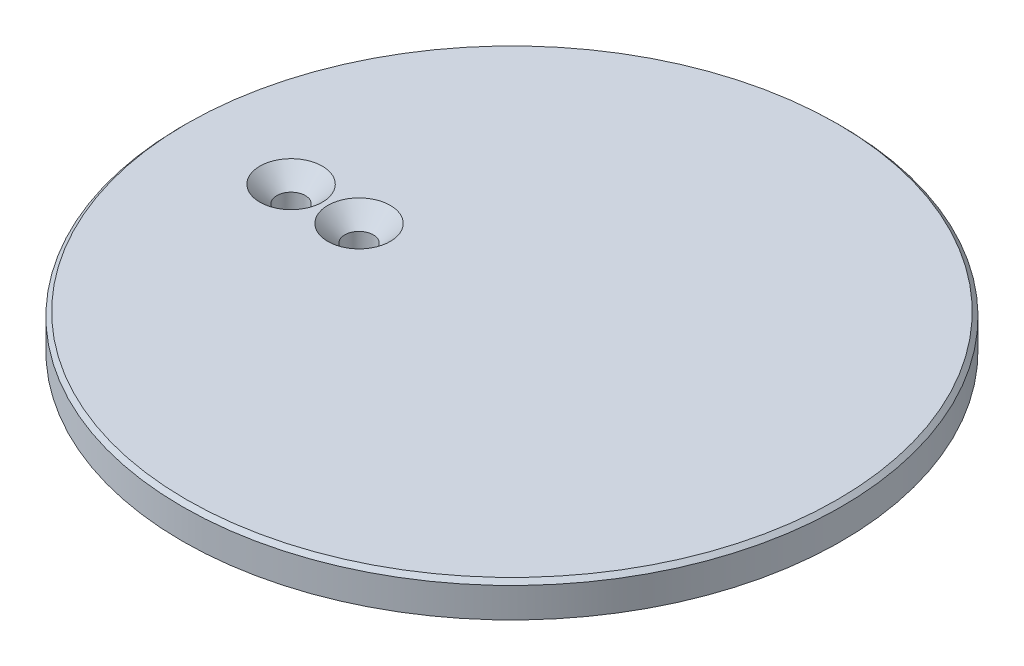
ISO-10303-21;
HEADER;
FILE_DESCRIPTION(('STEP AP214'),'2;1');
FILE_NAME('part.step','',(''),(''),'','','');
FILE_SCHEMA(('AUTOMOTIVE_DESIGN { 1 0 10303 214 1 1 1 1 }'));
ENDSEC;
DATA;
#1=APPLICATION_CONTEXT('core data for automotive mechanical design processes');
#2=APPLICATION_PROTOCOL_DEFINITION('international standard','automotive_design',2000,#1);
#3=PRODUCT_CONTEXT('',#1,'mechanical');
#4=PRODUCT('Part','Part','',(#3));
#5=PRODUCT_RELATED_PRODUCT_CATEGORY('part','',(#4));
#6=PRODUCT_DEFINITION_FORMATION('','',#4);
#7=PRODUCT_DEFINITION_CONTEXT('part definition',#1,'design');
#8=PRODUCT_DEFINITION('design','',#6,#7);
#9=PRODUCT_DEFINITION_SHAPE('','',#8);
#10=(LENGTH_UNIT() NAMED_UNIT(*) SI_UNIT(.MILLI.,.METRE.));
#11=(NAMED_UNIT(*) PLANE_ANGLE_UNIT() SI_UNIT($,.RADIAN.));
#12=(NAMED_UNIT(*) SI_UNIT($,.STERADIAN.) SOLID_ANGLE_UNIT());
#13=UNCERTAINTY_MEASURE_WITH_UNIT(LENGTH_MEASURE(1.E-05),#10,'distance_accuracy_value','');
#14=(GEOMETRIC_REPRESENTATION_CONTEXT(3) GLOBAL_UNCERTAINTY_ASSIGNED_CONTEXT((#13)) GLOBAL_UNIT_ASSIGNED_CONTEXT((#10,
#11,#12)) REPRESENTATION_CONTEXT('',''));
#15=CARTESIAN_POINT('',(0.,0.,0.));
#16=DIRECTION('',(0.,0.,1.));
#17=DIRECTION('',(1.,0.,0.));
#18=AXIS2_PLACEMENT_3D('',#15,#16,#17);
#19=CARTESIAN_POINT('',(0.,0.,0.));
#20=DIRECTION('',(0.,1.,0.));
#21=DIRECTION('',(0.,0.,1.));
#22=AXIS2_PLACEMENT_3D('',#19,#20,#21);
#23=PLANE('',#22);
#24=CARTESIAN_POINT('',(0.,0.,0.));
#25=DIRECTION('',(0.,1.,0.));
#26=DIRECTION('',(0.,0.,1.));
#27=AXIS2_PLACEMENT_3D('',#24,#25,#26);
#28=CIRCLE('',#27,48.5);
#29=CARTESIAN_POINT('',(0.,0.,48.5));
#30=VERTEX_POINT('',#29);
#31=EDGE_CURVE('E203',#30,#30,#28,.T.);
#32=ORIENTED_EDGE('',*,*,#31,.F.);
#33=EDGE_LOOP('',(#32));
#34=FACE_BOUND('',#33,.T.);
#35=DIRECTION('',(1.,0.,0.));
#36=VECTOR('',#35,1.);
#37=CARTESIAN_POINT('',(-37.5,0.,-8.5));
#38=LINE('',#37,#36);
#39=CARTESIAN_POINT('',(-37.5,0.,-8.5));
#40=VERTEX_POINT('',#39);
#41=CARTESIAN_POINT('',(-17.5,0.,-8.5));
#42=VERTEX_POINT('',#41);
#43=EDGE_CURVE('E114',#40,#42,#38,.T.);
#44=ORIENTED_EDGE('',*,*,#43,.F.);
#45=DIRECTION('',(0.,0.,-1.));
#46=VECTOR('',#45,1.);
#47=CARTESIAN_POINT('',(-37.5,0.,6.5));
#48=LINE('',#47,#46);
#49=CARTESIAN_POINT('',(-37.5,0.,8.5));
#50=VERTEX_POINT('',#49);
#51=EDGE_CURVE('E123',#50,#40,#48,.T.);
#52=ORIENTED_EDGE('',*,*,#51,.F.);
#53=DIRECTION('',(-1.,0.,0.));
#54=VECTOR('',#53,1.);
#55=CARTESIAN_POINT('',(-37.5,0.,8.5));
#56=LINE('',#55,#54);
#57=CARTESIAN_POINT('',(-17.5,0.,8.5));
#58=VERTEX_POINT('',#57);
#59=EDGE_CURVE('E116',#58,#50,#56,.T.);
#60=ORIENTED_EDGE('',*,*,#59,.F.);
#61=DIRECTION('',(0.,0.,1.));
#62=VECTOR('',#61,1.);
#63=CARTESIAN_POINT('',(-17.5,0.,6.5));
#64=LINE('',#63,#62);
#65=EDGE_CURVE('E112',#42,#58,#64,.T.);
#66=ORIENTED_EDGE('',*,*,#65,.F.);
#67=EDGE_LOOP('',(#44,#52,#60,#66));
#68=FACE_BOUND('',#67,.T.);
#69=ADVANCED_FACE('F44',(#34,#68),#23,.F.);
#70=CARTESIAN_POINT('',(0.,5.,0.));
#71=DIRECTION('',(0.,-1.,0.));
#72=DIRECTION('',(0.,0.,-1.));
#73=AXIS2_PLACEMENT_3D('',#70,#71,#72);
#74=CYLINDRICAL_SURFACE('',#73,48.5);
#75=CARTESIAN_POINT('',(0.,4.4,0.));
#76=DIRECTION('',(0.,1.,0.));
#77=DIRECTION('',(0.,0.,1.));
#78=AXIS2_PLACEMENT_3D('',#75,#76,#77);
#79=CIRCLE('',#78,48.5);
#80=CARTESIAN_POINT('',(0.,4.4,48.5));
#81=VERTEX_POINT('',#80);
#82=EDGE_CURVE('E213',#81,#81,#79,.F.);
#83=ORIENTED_EDGE('',*,*,#82,.T.);
#84=EDGE_LOOP('',(#83));
#85=FACE_BOUND('',#84,.T.);
#86=ORIENTED_EDGE('',*,*,#31,.T.);
#87=EDGE_LOOP('',(#86));
#88=FACE_BOUND('',#87,.T.);
#89=ADVANCED_FACE('F241',(#85,#88),#74,.T.);
#90=CARTESIAN_POINT('',(0.,5.,0.));
#91=DIRECTION('',(0.,1.,0.));
#92=DIRECTION('',(0.,0.,1.));
#93=AXIS2_PLACEMENT_3D('',#90,#91,#92);
#94=PLANE('',#93);
#95=CARTESIAN_POINT('',(-22.5,5.,0.));
#96=DIRECTION('',(0.,1.,0.));
#97=DIRECTION('',(0.,0.,1.));
#98=AXIS2_PLACEMENT_3D('',#95,#96,#97);
#99=CIRCLE('',#98,4.60000000000002);
#100=CARTESIAN_POINT('',(-22.5,5.,4.60000000000002));
#101=VERTEX_POINT('',#100);
#102=EDGE_CURVE('E221',#101,#101,#99,.F.);
#103=ORIENTED_EDGE('',*,*,#102,.T.);
#104=EDGE_LOOP('',(#103));
#105=FACE_BOUND('',#104,.T.);
#106=CARTESIAN_POINT('',(-32.5,5.,0.));
#107=DIRECTION('',(0.,1.,0.));
#108=DIRECTION('',(0.,0.,1.));
#109=AXIS2_PLACEMENT_3D('',#106,#107,#108);
#110=CIRCLE('',#109,4.60000000000002);
#111=CARTESIAN_POINT('',(-32.5,5.,4.60000000000002));
#112=VERTEX_POINT('',#111);
#113=EDGE_CURVE('E217',#112,#112,#110,.F.);
#114=ORIENTED_EDGE('',*,*,#113,.T.);
#115=EDGE_LOOP('',(#114));
#116=FACE_BOUND('',#115,.T.);
#117=CARTESIAN_POINT('',(0.,5.,0.));
#118=DIRECTION('',(0.,1.,0.));
#119=DIRECTION('',(0.,0.,1.));
#120=AXIS2_PLACEMENT_3D('',#117,#118,#119);
#121=CIRCLE('',#120,47.9);
#122=CARTESIAN_POINT('',(0.,5.,47.9));
#123=VERTEX_POINT('',#122);
#124=EDGE_CURVE('E209',#123,#123,#121,.T.);
#125=ORIENTED_EDGE('',*,*,#124,.T.);
#126=EDGE_LOOP('',(#125));
#127=FACE_BOUND('',#126,.T.);
#128=ADVANCED_FACE('F237',(#105,#116,#127),#94,.T.);
#129=CARTESIAN_POINT('',(-37.5,-20.,6.5));
#130=DIRECTION('',(1.,0.,0.));
#131=DIRECTION('',(0.,0.,-1.));
#132=AXIS2_PLACEMENT_3D('',#129,#130,#131);
#133=PLANE('',#132);
#134=ORIENTED_EDGE('',*,*,#51,.T.);
#135=DIRECTION('',(0.,1.,0.));
#136=VECTOR('',#135,1.);
#137=CARTESIAN_POINT('',(-37.5,-23.,-8.5));
#138=LINE('',#137,#136);
#139=CARTESIAN_POINT('',(-37.5,-23.,-8.5));
#140=VERTEX_POINT('',#139);
#141=EDGE_CURVE('E132',#140,#40,#138,.T.);
#142=ORIENTED_EDGE('',*,*,#141,.F.);
#143=DIRECTION('',(0.,0.,-1.));
#144=VECTOR('',#143,1.);
#145=CARTESIAN_POINT('',(-37.5,-23.,-6.5));
#146=LINE('',#145,#144);
#147=CARTESIAN_POINT('',(-37.5,-23.,-6.5));
#148=VERTEX_POINT('',#147);
#149=EDGE_CURVE('E134',#148,#140,#146,.T.);
#150=ORIENTED_EDGE('',*,*,#149,.F.);
#151=DIRECTION('',(0.,1.,0.));
#152=VECTOR('',#151,1.);
#153=CARTESIAN_POINT('',(-37.5,-23.,-6.5));
#154=LINE('',#153,#152);
#155=CARTESIAN_POINT('',(-37.5,-20.,-6.5));
#156=VERTEX_POINT('',#155);
#157=EDGE_CURVE('E142',#148,#156,#154,.T.);
#158=ORIENTED_EDGE('',*,*,#157,.T.);
#159=DIRECTION('',(0.,0.,-1.));
#160=VECTOR('',#159,1.);
#161=CARTESIAN_POINT('',(-37.5,-20.,6.5));
#162=LINE('',#161,#160);
#163=CARTESIAN_POINT('',(-37.5,-20.,6.5));
#164=VERTEX_POINT('',#163);
#165=EDGE_CURVE('E122',#164,#156,#162,.T.);
#166=ORIENTED_EDGE('',*,*,#165,.F.);
#167=DIRECTION('',(0.,1.,0.));
#168=VECTOR('',#167,1.);
#169=CARTESIAN_POINT('',(-37.5,-23.,6.5));
#170=LINE('',#169,#168);
#171=CARTESIAN_POINT('',(-37.5,-23.,6.5));
#172=VERTEX_POINT('',#171);
#173=EDGE_CURVE('E61',#172,#164,#170,.T.);
#174=ORIENTED_EDGE('',*,*,#173,.F.);
#175=DIRECTION('',(0.,0.,-1.));
#176=VECTOR('',#175,1.);
#177=CARTESIAN_POINT('',(-37.5,-23.,6.5));
#178=LINE('',#177,#176);
#179=CARTESIAN_POINT('',(-37.5,-23.,8.5));
#180=VERTEX_POINT('',#179);
#181=EDGE_CURVE('E162',#180,#172,#178,.T.);
#182=ORIENTED_EDGE('',*,*,#181,.F.);
#183=DIRECTION('',(0.,1.,0.));
#184=VECTOR('',#183,1.);
#185=CARTESIAN_POINT('',(-37.5,-23.,8.5));
#186=LINE('',#185,#184);
#187=EDGE_CURVE('E175',#180,#50,#186,.T.);
#188=ORIENTED_EDGE('',*,*,#187,.T.);
#189=EDGE_LOOP('',(#134,#142,#150,#158,#166,#174,#182,#188));
#190=FACE_BOUND('',#189,.T.);
#191=ADVANCED_FACE('F240',(#190),#133,.F.);
#192=CARTESIAN_POINT('',(-17.5,-20.,6.5));
#193=DIRECTION('',(-1.,0.,0.));
#194=DIRECTION('',(0.,0.,1.));
#195=AXIS2_PLACEMENT_3D('',#192,#193,#194);
#196=PLANE('',#195);
#197=ORIENTED_EDGE('',*,*,#65,.T.);
#198=DIRECTION('',(0.,1.,0.));
#199=VECTOR('',#198,1.);
#200=CARTESIAN_POINT('',(-17.5,-23.,8.5));
#201=LINE('',#200,#199);
#202=CARTESIAN_POINT('',(-17.5,-23.,8.5));
#203=VERTEX_POINT('',#202);
#204=EDGE_CURVE('E181',#203,#58,#201,.T.);
#205=ORIENTED_EDGE('',*,*,#204,.F.);
#206=DIRECTION('',(0.,0.,1.));
#207=VECTOR('',#206,1.);
#208=CARTESIAN_POINT('',(-17.5,-23.,6.5));
#209=LINE('',#208,#207);
#210=CARTESIAN_POINT('',(-17.5,-23.,6.5));
#211=VERTEX_POINT('',#210);
#212=EDGE_CURVE('E169',#211,#203,#209,.T.);
#213=ORIENTED_EDGE('',*,*,#212,.F.);
#214=DIRECTION('',(0.,1.,0.));
#215=VECTOR('',#214,1.);
#216=CARTESIAN_POINT('',(-17.5,-23.,6.5));
#217=LINE('',#216,#215);
#218=CARTESIAN_POINT('',(-17.5,-20.,6.5));
#219=VERTEX_POINT('',#218);
#220=EDGE_CURVE('E184',#211,#219,#217,.T.);
#221=ORIENTED_EDGE('',*,*,#220,.T.);
#222=DIRECTION('',(0.,0.,1.));
#223=VECTOR('',#222,1.);
#224=CARTESIAN_POINT('',(-17.5,-20.,6.5));
#225=LINE('',#224,#223);
#226=CARTESIAN_POINT('',(-17.5,-20.,-6.5));
#227=VERTEX_POINT('',#226);
#228=EDGE_CURVE('E196',#227,#219,#225,.T.);
#229=ORIENTED_EDGE('',*,*,#228,.F.);
#230=DIRECTION('',(0.,1.,0.));
#231=VECTOR('',#230,1.);
#232=CARTESIAN_POINT('',(-17.5,-23.,-6.5));
#233=LINE('',#232,#231);
#234=CARTESIAN_POINT('',(-17.5,-23.,-6.5));
#235=VERTEX_POINT('',#234);
#236=EDGE_CURVE('E69',#235,#227,#233,.T.);
#237=ORIENTED_EDGE('',*,*,#236,.F.);
#238=DIRECTION('',(0.,0.,1.));
#239=VECTOR('',#238,1.);
#240=CARTESIAN_POINT('',(-17.5,-23.,-6.5));
#241=LINE('',#240,#239);
#242=CARTESIAN_POINT('',(-17.5,-23.,-8.5));
#243=VERTEX_POINT('',#242);
#244=EDGE_CURVE('E137',#243,#235,#241,.T.);
#245=ORIENTED_EDGE('',*,*,#244,.F.);
#246=DIRECTION('',(0.,1.,0.));
#247=VECTOR('',#246,1.);
#248=CARTESIAN_POINT('',(-17.5,-23.,-8.5));
#249=LINE('',#248,#247);
#250=EDGE_CURVE('E129',#243,#42,#249,.T.);
#251=ORIENTED_EDGE('',*,*,#250,.T.);
#252=EDGE_LOOP('',(#197,#205,#213,#221,#229,#237,#245,#251));
#253=FACE_BOUND('',#252,.T.);
#254=ADVANCED_FACE('F136',(#253),#196,.F.);
#255=CARTESIAN_POINT('',(0.,-20.,0.));
#256=DIRECTION('',(0.,-1.,0.));
#257=DIRECTION('',(0.,0.,-1.));
#258=AXIS2_PLACEMENT_3D('',#255,#256,#257);
#259=PLANE('',#258);
#260=CARTESIAN_POINT('',(-32.5,-20.,0.));
#261=DIRECTION('',(0.,-1.,0.));
#262=DIRECTION('',(0.,0.,-1.));
#263=AXIS2_PLACEMENT_3D('',#260,#261,#262);
#264=CIRCLE('',#263,2.1);
#265=CARTESIAN_POINT('',(-32.5,-20.,-2.1));
#266=VERTEX_POINT('',#265);
#267=EDGE_CURVE('E144',#266,#266,#264,.T.);
#268=ORIENTED_EDGE('',*,*,#267,.F.);
#269=EDGE_LOOP('',(#268));
#270=FACE_BOUND('',#269,.T.);
#271=CARTESIAN_POINT('',(-22.5,-20.,0.));
#272=DIRECTION('',(0.,-1.,0.));
#273=DIRECTION('',(0.,0.,-1.));
#274=AXIS2_PLACEMENT_3D('',#271,#272,#273);
#275=CIRCLE('',#274,2.1);
#276=CARTESIAN_POINT('',(-22.5,-20.,-2.1));
#277=VERTEX_POINT('',#276);
#278=EDGE_CURVE('E501',#277,#277,#275,.T.);
#279=ORIENTED_EDGE('',*,*,#278,.F.);
#280=EDGE_LOOP('',(#279));
#281=FACE_BOUND('',#280,.T.);
#282=ORIENTED_EDGE('',*,*,#165,.T.);
#283=DIRECTION('',(1.,0.,0.));
#284=VECTOR('',#283,1.);
#285=CARTESIAN_POINT('',(-37.5,-20.,-6.5));
#286=LINE('',#285,#284);
#287=EDGE_CURVE('E193',#156,#227,#286,.T.);
#288=ORIENTED_EDGE('',*,*,#287,.T.);
#289=ORIENTED_EDGE('',*,*,#228,.T.);
#290=DIRECTION('',(-1.,0.,0.));
#291=VECTOR('',#290,1.);
#292=CARTESIAN_POINT('',(-37.5,-20.,6.5));
#293=LINE('',#292,#291);
#294=EDGE_CURVE('E200',#219,#164,#293,.T.);
#295=ORIENTED_EDGE('',*,*,#294,.T.);
#296=EDGE_LOOP('',(#282,#288,#289,#295));
#297=FACE_BOUND('',#296,.T.);
#298=ADVANCED_FACE('F273',(#270,#281,#297),#259,.T.);
#299=CARTESIAN_POINT('',(-37.5,-23.,6.5));
#300=DIRECTION('',(0.,0.,1.));
#301=DIRECTION('',(1.,0.,0.));
#302=AXIS2_PLACEMENT_3D('',#299,#300,#301);
#303=PLANE('',#302);
#304=ORIENTED_EDGE('',*,*,#294,.F.);
#305=ORIENTED_EDGE('',*,*,#220,.F.);
#306=DIRECTION('',(1.,0.,0.));
#307=VECTOR('',#306,1.);
#308=CARTESIAN_POINT('',(-37.5,-23.,6.5));
#309=LINE('',#308,#307);
#310=EDGE_CURVE('E166',#172,#211,#309,.T.);
#311=ORIENTED_EDGE('',*,*,#310,.F.);
#312=ORIENTED_EDGE('',*,*,#173,.T.);
#313=EDGE_LOOP('',(#304,#305,#311,#312));
#314=FACE_BOUND('',#313,.T.);
#315=ADVANCED_FACE('F276',(#314),#303,.F.);
#316=CARTESIAN_POINT('',(-37.5,-23.,8.5));
#317=DIRECTION('',(0.,0.,-1.));
#318=DIRECTION('',(-1.,0.,0.));
#319=AXIS2_PLACEMENT_3D('',#316,#317,#318);
#320=PLANE('',#319);
#321=ORIENTED_EDGE('',*,*,#59,.T.);
#322=ORIENTED_EDGE('',*,*,#187,.F.);
#323=DIRECTION('',(-1.,0.,0.));
#324=VECTOR('',#323,1.);
#325=CARTESIAN_POINT('',(-37.5,-23.,8.5));
#326=LINE('',#325,#324);
#327=EDGE_CURVE('E172',#203,#180,#326,.T.);
#328=ORIENTED_EDGE('',*,*,#327,.F.);
#329=ORIENTED_EDGE('',*,*,#204,.T.);
#330=EDGE_LOOP('',(#321,#322,#328,#329));
#331=FACE_BOUND('',#330,.T.);
#332=ADVANCED_FACE('F280',(#331),#320,.F.);
#333=CARTESIAN_POINT('',(0.,-23.,0.));
#334=DIRECTION('',(0.,1.,0.));
#335=DIRECTION('',(0.,0.,1.));
#336=AXIS2_PLACEMENT_3D('',#333,#334,#335);
#337=PLANE('',#336);
#338=ORIENTED_EDGE('',*,*,#181,.T.);
#339=ORIENTED_EDGE('',*,*,#310,.T.);
#340=ORIENTED_EDGE('',*,*,#212,.T.);
#341=ORIENTED_EDGE('',*,*,#327,.T.);
#342=EDGE_LOOP('',(#338,#339,#340,#341));
#343=FACE_BOUND('',#342,.T.);
#344=ADVANCED_FACE('F283',(#343),#337,.F.);
#345=CARTESIAN_POINT('',(-37.5,-23.,-8.5));
#346=DIRECTION('',(0.,0.,1.));
#347=DIRECTION('',(1.,0.,0.));
#348=AXIS2_PLACEMENT_3D('',#345,#346,#347);
#349=PLANE('',#348);
#350=ORIENTED_EDGE('',*,*,#43,.T.);
#351=ORIENTED_EDGE('',*,*,#250,.F.);
#352=DIRECTION('',(1.,0.,0.));
#353=VECTOR('',#352,1.);
#354=CARTESIAN_POINT('',(-37.5,-23.,-8.5));
#355=LINE('',#354,#353);
#356=EDGE_CURVE('E156',#140,#243,#355,.T.);
#357=ORIENTED_EDGE('',*,*,#356,.F.);
#358=ORIENTED_EDGE('',*,*,#141,.T.);
#359=EDGE_LOOP('',(#350,#351,#357,#358));
#360=FACE_BOUND('',#359,.T.);
#361=ADVANCED_FACE('F128',(#360),#349,.F.);
#362=CARTESIAN_POINT('',(-37.5,-23.,-6.5));
#363=DIRECTION('',(0.,0.,-1.));
#364=DIRECTION('',(-1.,0.,0.));
#365=AXIS2_PLACEMENT_3D('',#362,#363,#364);
#366=PLANE('',#365);
#367=ORIENTED_EDGE('',*,*,#287,.F.);
#368=ORIENTED_EDGE('',*,*,#157,.F.);
#369=DIRECTION('',(-1.,0.,0.));
#370=VECTOR('',#369,1.);
#371=CARTESIAN_POINT('',(-37.5,-23.,-6.5));
#372=LINE('',#371,#370);
#373=EDGE_CURVE('E150',#235,#148,#372,.T.);
#374=ORIENTED_EDGE('',*,*,#373,.F.);
#375=ORIENTED_EDGE('',*,*,#236,.T.);
#376=EDGE_LOOP('',(#367,#368,#374,#375));
#377=FACE_BOUND('',#376,.T.);
#378=ADVANCED_FACE('F291',(#377),#366,.F.);
#379=CARTESIAN_POINT('',(0.,-23.,0.));
#380=DIRECTION('',(0.,-1.,0.));
#381=DIRECTION('',(0.,0.,-1.));
#382=AXIS2_PLACEMENT_3D('',#379,#380,#381);
#383=PLANE('',#382);
#384=ORIENTED_EDGE('',*,*,#149,.T.);
#385=ORIENTED_EDGE('',*,*,#356,.T.);
#386=ORIENTED_EDGE('',*,*,#244,.T.);
#387=ORIENTED_EDGE('',*,*,#373,.T.);
#388=EDGE_LOOP('',(#384,#385,#386,#387));
#389=FACE_BOUND('',#388,.T.);
#390=ADVANCED_FACE('F288',(#389),#383,.T.);
#391=CARTESIAN_POINT('',(-22.5,5.,0.));
#392=DIRECTION('',(0.,-1.,0.));
#393=DIRECTION('',(0.,0.,-1.));
#394=AXIS2_PLACEMENT_3D('',#391,#392,#393);
#395=CYLINDRICAL_SURFACE('',#394,2.1);
#396=CARTESIAN_POINT('',(-22.5,2.49999999999996,0.));
#397=DIRECTION('',(0.,1.,0.));
#398=DIRECTION('',(0.,0.,1.));
#399=AXIS2_PLACEMENT_3D('',#396,#397,#398);
#400=CIRCLE('',#399,2.1);
#401=CARTESIAN_POINT('',(-22.5,2.49999999999996,2.1));
#402=VERTEX_POINT('',#401);
#403=EDGE_CURVE('E54',#402,#402,#400,.T.);
#404=ORIENTED_EDGE('',*,*,#403,.T.);
#405=EDGE_LOOP('',(#404));
#406=FACE_BOUND('',#405,.T.);
#407=ORIENTED_EDGE('',*,*,#278,.T.);
#408=EDGE_LOOP('',(#407));
#409=FACE_BOUND('',#408,.T.);
#410=ADVANCED_FACE('F228',(#406,#409),#395,.F.);
#411=CARTESIAN_POINT('',(-32.5,5.,0.));
#412=DIRECTION('',(0.,-1.,0.));
#413=DIRECTION('',(0.,0.,-1.));
#414=AXIS2_PLACEMENT_3D('',#411,#412,#413);
#415=CYLINDRICAL_SURFACE('',#414,2.1);
#416=CARTESIAN_POINT('',(-32.5,2.49999999999996,0.));
#417=DIRECTION('',(0.,1.,0.));
#418=DIRECTION('',(0.,0.,1.));
#419=AXIS2_PLACEMENT_3D('',#416,#417,#418);
#420=CIRCLE('',#419,2.1);
#421=CARTESIAN_POINT('',(-32.5,2.49999999999996,2.1));
#422=VERTEX_POINT('',#421);
#423=EDGE_CURVE('E11',#422,#422,#420,.T.);
#424=ORIENTED_EDGE('',*,*,#423,.T.);
#425=EDGE_LOOP('',(#424));
#426=FACE_BOUND('',#425,.T.);
#427=ORIENTED_EDGE('',*,*,#267,.T.);
#428=EDGE_LOOP('',(#427));
#429=FACE_BOUND('',#428,.T.);
#430=ADVANCED_FACE('F248',(#426,#429),#415,.F.);
#431=CARTESIAN_POINT('',(0.,5.,0.));
#432=DIRECTION('',(0.,-1.,0.));
#433=DIRECTION('',(0.,0.,-1.));
#434=AXIS2_PLACEMENT_3D('',#431,#432,#433);
#435=CONICAL_SURFACE('',#434,47.9,0.785398163397466);
#436=ORIENTED_EDGE('',*,*,#82,.F.);
#437=EDGE_LOOP('',(#436));
#438=FACE_BOUND('',#437,.T.);
#439=ORIENTED_EDGE('',*,*,#124,.F.);
#440=EDGE_LOOP('',(#439));
#441=FACE_BOUND('',#440,.T.);
#442=ADVANCED_FACE('F234',(#438,#441),#435,.T.);
#443=CARTESIAN_POINT('',(-22.5,5.,0.));
#444=DIRECTION('',(0.,1.,0.));
#445=DIRECTION('',(0.,0.,1.));
#446=AXIS2_PLACEMENT_3D('',#443,#444,#445);
#447=CONICAL_SURFACE('',#446,4.60000000000002,0.785398163397444);
#448=ORIENTED_EDGE('',*,*,#403,.F.);
#449=EDGE_LOOP('',(#448));
#450=FACE_BOUND('',#449,.T.);
#451=ORIENTED_EDGE('',*,*,#102,.F.);
#452=EDGE_LOOP('',(#451));
#453=FACE_BOUND('',#452,.T.);
#454=ADVANCED_FACE('F231',(#450,#453),#447,.F.);
#455=CARTESIAN_POINT('',(-32.5,5.,0.));
#456=DIRECTION('',(0.,1.,0.));
#457=DIRECTION('',(0.,0.,1.));
#458=AXIS2_PLACEMENT_3D('',#455,#456,#457);
#459=CONICAL_SURFACE('',#458,4.60000000000002,0.785398163397444);
#460=ORIENTED_EDGE('',*,*,#423,.F.);
#461=EDGE_LOOP('',(#460));
#462=FACE_BOUND('',#461,.T.);
#463=ORIENTED_EDGE('',*,*,#113,.F.);
#464=EDGE_LOOP('',(#463));
#465=FACE_BOUND('',#464,.T.);
#466=ADVANCED_FACE('F47',(#462,#465),#459,.F.);
#467=CLOSED_SHELL('',(#69,#89,#128,#191,#254,#298,#315,#332,#344,#361,#378,#390,#410,#430,#442,
#454,#466));
#468=MANIFOLD_SOLID_BREP('B2',#467);
#469=ADVANCED_BREP_SHAPE_REPRESENTATION('',(#18,#468),#14);
#470=SHAPE_DEFINITION_REPRESENTATION(#9,#469);
ENDSEC;
END-ISO-10303-21;
